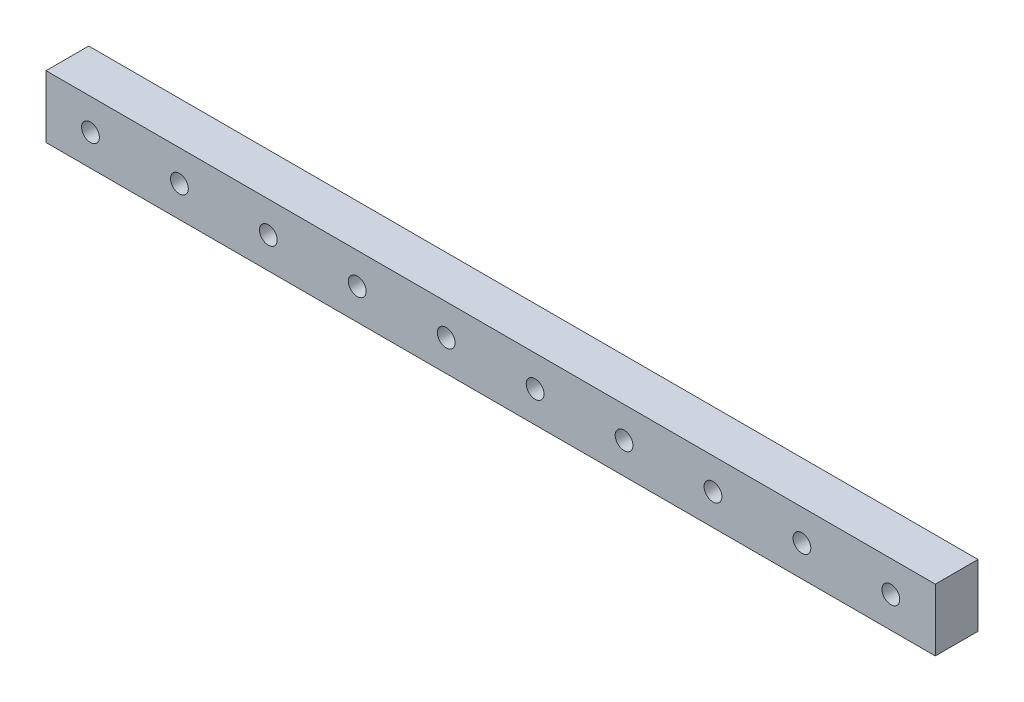
ISO-10303-21;
HEADER;
FILE_DESCRIPTION(('STEP AP214'),'2;1');
FILE_NAME('part.step','',(''),(''),'','','');
FILE_SCHEMA(('AUTOMOTIVE_DESIGN { 1 0 10303 214 1 1 1 1 }'));
ENDSEC;
DATA;
#1=APPLICATION_CONTEXT('core data for automotive mechanical design processes');
#2=APPLICATION_PROTOCOL_DEFINITION('international standard','automotive_design',2000,#1);
#3=PRODUCT_CONTEXT('',#1,'mechanical');
#4=PRODUCT('Part','Part','',(#3));
#5=PRODUCT_RELATED_PRODUCT_CATEGORY('part','',(#4));
#6=PRODUCT_DEFINITION_FORMATION('','',#4);
#7=PRODUCT_DEFINITION_CONTEXT('part definition',#1,'design');
#8=PRODUCT_DEFINITION('design','',#6,#7);
#9=PRODUCT_DEFINITION_SHAPE('','',#8);
#10=(LENGTH_UNIT() NAMED_UNIT(*) SI_UNIT(.MILLI.,.METRE.));
#11=(NAMED_UNIT(*) PLANE_ANGLE_UNIT() SI_UNIT($,.RADIAN.));
#12=(NAMED_UNIT(*) SI_UNIT($,.STERADIAN.) SOLID_ANGLE_UNIT());
#13=UNCERTAINTY_MEASURE_WITH_UNIT(LENGTH_MEASURE(1.E-05),#10,'distance_accuracy_value','');
#14=(GEOMETRIC_REPRESENTATION_CONTEXT(3) GLOBAL_UNCERTAINTY_ASSIGNED_CONTEXT((#13)) GLOBAL_UNIT_ASSIGNED_CONTEXT((#10,
#11,#12)) REPRESENTATION_CONTEXT('',''));
#15=CARTESIAN_POINT('',(0.,0.,0.));
#16=DIRECTION('',(0.,0.,1.));
#17=DIRECTION('',(1.,0.,0.));
#18=AXIS2_PLACEMENT_3D('',#15,#16,#17);
#19=CARTESIAN_POINT('',(0.,0.,4.8));
#20=DIRECTION('',(1.,0.,0.));
#21=DIRECTION('',(0.,0.,-1.));
#22=AXIS2_PLACEMENT_3D('',#19,#20,#21);
#23=PLANE('',#22);
#24=DIRECTION('',(0.,-1.,0.));
#25=VECTOR('',#24,1.);
#26=CARTESIAN_POINT('',(0.,0.,0.));
#27=LINE('',#26,#25);
#28=CARTESIAN_POINT('',(0.,7.,0.));
#29=VERTEX_POINT('',#28);
#30=CARTESIAN_POINT('',(0.,0.,0.));
#31=VERTEX_POINT('',#30);
#32=EDGE_CURVE('E102',#29,#31,#27,.T.);
#33=ORIENTED_EDGE('',*,*,#32,.T.);
#34=DIRECTION('',(0.,0.,-1.));
#35=VECTOR('',#34,1.);
#36=CARTESIAN_POINT('',(0.,0.,4.8));
#37=LINE('',#36,#35);
#38=CARTESIAN_POINT('',(0.,0.,4.8));
#39=VERTEX_POINT('',#38);
#40=EDGE_CURVE('E11',#39,#31,#37,.T.);
#41=ORIENTED_EDGE('',*,*,#40,.F.);
#42=DIRECTION('',(0.,-1.,0.));
#43=VECTOR('',#42,1.);
#44=CARTESIAN_POINT('',(0.,0.,4.8));
#45=LINE('',#44,#43);
#46=CARTESIAN_POINT('',(0.,7.,4.8));
#47=VERTEX_POINT('',#46);
#48=EDGE_CURVE('E90',#47,#39,#45,.T.);
#49=ORIENTED_EDGE('',*,*,#48,.F.);
#50=DIRECTION('',(0.,0.,-1.));
#51=VECTOR('',#50,1.);
#52=CARTESIAN_POINT('',(0.,7.,4.8));
#53=LINE('',#52,#51);
#54=EDGE_CURVE('E98',#47,#29,#53,.T.);
#55=ORIENTED_EDGE('',*,*,#54,.T.);
#56=EDGE_LOOP('',(#33,#41,#49,#55));
#57=FACE_BOUND('',#56,.T.);
#58=ADVANCED_FACE('F39',(#57),#23,.F.);
#59=CARTESIAN_POINT('',(0.,0.,4.8));
#60=DIRECTION('',(0.,1.,0.));
#61=DIRECTION('',(0.,0.,1.));
#62=AXIS2_PLACEMENT_3D('',#59,#60,#61);
#63=PLANE('',#62);
#64=DIRECTION('',(1.,0.,0.));
#65=VECTOR('',#64,1.);
#66=CARTESIAN_POINT('',(0.,0.,0.));
#67=LINE('',#66,#65);
#68=CARTESIAN_POINT('',(100.,0.,0.));
#69=VERTEX_POINT('',#68);
#70=EDGE_CURVE('E94',#31,#69,#67,.T.);
#71=ORIENTED_EDGE('',*,*,#70,.T.);
#72=DIRECTION('',(0.,0.,-1.));
#73=VECTOR('',#72,1.);
#74=CARTESIAN_POINT('',(100.,0.,4.8));
#75=LINE('',#74,#73);
#76=CARTESIAN_POINT('',(100.,0.,4.8));
#77=VERTEX_POINT('',#76);
#78=EDGE_CURVE('E47',#77,#69,#75,.T.);
#79=ORIENTED_EDGE('',*,*,#78,.F.);
#80=DIRECTION('',(1.,0.,0.));
#81=VECTOR('',#80,1.);
#82=CARTESIAN_POINT('',(0.,0.,4.8));
#83=LINE('',#82,#81);
#84=EDGE_CURVE('E85',#39,#77,#83,.T.);
#85=ORIENTED_EDGE('',*,*,#84,.F.);
#86=ORIENTED_EDGE('',*,*,#40,.T.);
#87=EDGE_LOOP('',(#71,#79,#85,#86));
#88=FACE_BOUND('',#87,.T.);
#89=ADVANCED_FACE('F93',(#88),#63,.F.);
#90=CARTESIAN_POINT('',(100.,0.,4.8));
#91=DIRECTION('',(-1.,0.,0.));
#92=DIRECTION('',(0.,0.,1.));
#93=AXIS2_PLACEMENT_3D('',#90,#91,#92);
#94=PLANE('',#93);
#95=DIRECTION('',(0.,1.,0.));
#96=VECTOR('',#95,1.);
#97=CARTESIAN_POINT('',(100.,0.,0.));
#98=LINE('',#97,#96);
#99=CARTESIAN_POINT('',(100.,7.,0.));
#100=VERTEX_POINT('',#99);
#101=EDGE_CURVE('E72',#69,#100,#98,.T.);
#102=ORIENTED_EDGE('',*,*,#101,.T.);
#103=DIRECTION('',(0.,0.,-1.));
#104=VECTOR('',#103,1.);
#105=CARTESIAN_POINT('',(100.,7.,4.8));
#106=LINE('',#105,#104);
#107=CARTESIAN_POINT('',(100.,7.,4.8));
#108=VERTEX_POINT('',#107);
#109=EDGE_CURVE('E95',#108,#100,#106,.T.);
#110=ORIENTED_EDGE('',*,*,#109,.F.);
#111=DIRECTION('',(0.,1.,0.));
#112=VECTOR('',#111,1.);
#113=CARTESIAN_POINT('',(100.,0.,4.8));
#114=LINE('',#113,#112);
#115=EDGE_CURVE('E88',#77,#108,#114,.T.);
#116=ORIENTED_EDGE('',*,*,#115,.F.);
#117=ORIENTED_EDGE('',*,*,#78,.T.);
#118=EDGE_LOOP('',(#102,#110,#116,#117));
#119=FACE_BOUND('',#118,.T.);
#120=ADVANCED_FACE('F96',(#119),#94,.F.);
#121=CARTESIAN_POINT('',(0.,7.,4.8));
#122=DIRECTION('',(0.,-1.,0.));
#123=DIRECTION('',(0.,0.,-1.));
#124=AXIS2_PLACEMENT_3D('',#121,#122,#123);
#125=PLANE('',#124);
#126=DIRECTION('',(-1.,0.,0.));
#127=VECTOR('',#126,1.);
#128=CARTESIAN_POINT('',(0.,7.,0.));
#129=LINE('',#128,#127);
#130=EDGE_CURVE('E78',#100,#29,#129,.T.);
#131=ORIENTED_EDGE('',*,*,#130,.T.);
#132=ORIENTED_EDGE('',*,*,#54,.F.);
#133=DIRECTION('',(-1.,0.,0.));
#134=VECTOR('',#133,1.);
#135=CARTESIAN_POINT('',(0.,7.,4.8));
#136=LINE('',#135,#134);
#137=EDGE_CURVE('E55',#108,#47,#136,.T.);
#138=ORIENTED_EDGE('',*,*,#137,.F.);
#139=ORIENTED_EDGE('',*,*,#109,.T.);
#140=EDGE_LOOP('',(#131,#132,#138,#139));
#141=FACE_BOUND('',#140,.T.);
#142=ADVANCED_FACE('F110',(#141),#125,.F.);
#143=CARTESIAN_POINT('',(0.,0.,4.8));
#144=DIRECTION('',(0.,0.,-1.));
#145=DIRECTION('',(-1.,0.,0.));
#146=AXIS2_PLACEMENT_3D('',#143,#144,#145);
#147=PLANE('',#146);
#148=CARTESIAN_POINT('',(5.,3.5,4.8));
#149=DIRECTION('',(0.,0.,1.));
#150=DIRECTION('',(1.,0.,0.));
#151=AXIS2_PLACEMENT_3D('',#148,#149,#150);
#152=CIRCLE('',#151,1.);
#153=CARTESIAN_POINT('',(6.,3.5,4.8));
#154=VERTEX_POINT('',#153);
#155=EDGE_CURVE('E165',#154,#154,#152,.T.);
#156=ORIENTED_EDGE('',*,*,#155,.F.);
#157=EDGE_LOOP('',(#156));
#158=FACE_BOUND('',#157,.T.);
#159=CARTESIAN_POINT('',(65.,3.5,4.8));
#160=DIRECTION('',(0.,0.,1.));
#161=DIRECTION('',(1.,0.,0.));
#162=AXIS2_PLACEMENT_3D('',#159,#160,#161);
#163=CIRCLE('',#162,0.999999999999998);
#164=CARTESIAN_POINT('',(66.,3.5,4.8));
#165=VERTEX_POINT('',#164);
#166=EDGE_CURVE('E120',#165,#165,#163,.T.);
#167=ORIENTED_EDGE('',*,*,#166,.F.);
#168=EDGE_LOOP('',(#167));
#169=FACE_BOUND('',#168,.T.);
#170=CARTESIAN_POINT('',(95.,3.5,4.8));
#171=DIRECTION('',(0.,0.,1.));
#172=DIRECTION('',(1.,0.,0.));
#173=AXIS2_PLACEMENT_3D('',#170,#171,#172);
#174=CIRCLE('',#173,0.999999999999998);
#175=CARTESIAN_POINT('',(96.,3.5,4.8));
#176=VERTEX_POINT('',#175);
#177=EDGE_CURVE('E119',#176,#176,#174,.T.);
#178=ORIENTED_EDGE('',*,*,#177,.F.);
#179=EDGE_LOOP('',(#178));
#180=FACE_BOUND('',#179,.T.);
#181=CARTESIAN_POINT('',(85.,3.5,4.8));
#182=DIRECTION('',(0.,0.,1.));
#183=DIRECTION('',(1.,0.,0.));
#184=AXIS2_PLACEMENT_3D('',#181,#182,#183);
#185=CIRCLE('',#184,0.999999999999998);
#186=CARTESIAN_POINT('',(86.,3.5,4.8));
#187=VERTEX_POINT('',#186);
#188=EDGE_CURVE('E126',#187,#187,#185,.T.);
#189=ORIENTED_EDGE('',*,*,#188,.F.);
#190=EDGE_LOOP('',(#189));
#191=FACE_BOUND('',#190,.T.);
#192=CARTESIAN_POINT('',(75.,3.5,4.8));
#193=DIRECTION('',(0.,0.,1.));
#194=DIRECTION('',(1.,0.,0.));
#195=AXIS2_PLACEMENT_3D('',#192,#193,#194);
#196=CIRCLE('',#195,0.999999999999998);
#197=CARTESIAN_POINT('',(76.,3.5,4.8));
#198=VERTEX_POINT('',#197);
#199=EDGE_CURVE('E132',#198,#198,#196,.T.);
#200=ORIENTED_EDGE('',*,*,#199,.F.);
#201=EDGE_LOOP('',(#200));
#202=FACE_BOUND('',#201,.T.);
#203=CARTESIAN_POINT('',(55.,3.5,4.8));
#204=DIRECTION('',(0.,0.,1.));
#205=DIRECTION('',(1.,0.,0.));
#206=AXIS2_PLACEMENT_3D('',#203,#204,#205);
#207=CIRCLE('',#206,1.);
#208=CARTESIAN_POINT('',(56.,3.5,4.8));
#209=VERTEX_POINT('',#208);
#210=EDGE_CURVE('E138',#209,#209,#207,.T.);
#211=ORIENTED_EDGE('',*,*,#210,.F.);
#212=EDGE_LOOP('',(#211));
#213=FACE_BOUND('',#212,.T.);
#214=CARTESIAN_POINT('',(45.,3.5,4.8));
#215=DIRECTION('',(0.,0.,1.));
#216=DIRECTION('',(1.,0.,0.));
#217=AXIS2_PLACEMENT_3D('',#214,#215,#216);
#218=CIRCLE('',#217,1.);
#219=CARTESIAN_POINT('',(46.,3.5,4.8));
#220=VERTEX_POINT('',#219);
#221=EDGE_CURVE('E144',#220,#220,#218,.T.);
#222=ORIENTED_EDGE('',*,*,#221,.F.);
#223=EDGE_LOOP('',(#222));
#224=FACE_BOUND('',#223,.T.);
#225=CARTESIAN_POINT('',(35.,3.5,4.8));
#226=DIRECTION('',(0.,0.,1.));
#227=DIRECTION('',(1.,0.,0.));
#228=AXIS2_PLACEMENT_3D('',#225,#226,#227);
#229=CIRCLE('',#228,1.);
#230=CARTESIAN_POINT('',(36.,3.5,4.8));
#231=VERTEX_POINT('',#230);
#232=EDGE_CURVE('E150',#231,#231,#229,.T.);
#233=ORIENTED_EDGE('',*,*,#232,.F.);
#234=EDGE_LOOP('',(#233));
#235=FACE_BOUND('',#234,.T.);
#236=CARTESIAN_POINT('',(25.,3.5,4.8));
#237=DIRECTION('',(0.,0.,1.));
#238=DIRECTION('',(1.,0.,0.));
#239=AXIS2_PLACEMENT_3D('',#236,#237,#238);
#240=CIRCLE('',#239,0.999999999999998);
#241=CARTESIAN_POINT('',(26.,3.5,4.8));
#242=VERTEX_POINT('',#241);
#243=EDGE_CURVE('E156',#242,#242,#240,.T.);
#244=ORIENTED_EDGE('',*,*,#243,.F.);
#245=EDGE_LOOP('',(#244));
#246=FACE_BOUND('',#245,.T.);
#247=CARTESIAN_POINT('',(15.,3.5,4.8));
#248=DIRECTION('',(0.,0.,1.));
#249=DIRECTION('',(1.,0.,0.));
#250=AXIS2_PLACEMENT_3D('',#247,#248,#249);
#251=CIRCLE('',#250,1.);
#252=CARTESIAN_POINT('',(16.,3.5,4.8));
#253=VERTEX_POINT('',#252);
#254=EDGE_CURVE('E162',#253,#253,#251,.T.);
#255=ORIENTED_EDGE('',*,*,#254,.F.);
#256=EDGE_LOOP('',(#255));
#257=FACE_BOUND('',#256,.T.);
#258=ORIENTED_EDGE('',*,*,#48,.T.);
#259=ORIENTED_EDGE('',*,*,#84,.T.);
#260=ORIENTED_EDGE('',*,*,#115,.T.);
#261=ORIENTED_EDGE('',*,*,#137,.T.);
#262=EDGE_LOOP('',(#258,#259,#260,#261));
#263=FACE_BOUND('',#262,.T.);
#264=ADVANCED_FACE('F86',(#158,#169,#180,#191,#202,#213,#224,#235,#246,#257,#263),#147,.F.);
#265=CARTESIAN_POINT('',(0.,0.,0.));
#266=DIRECTION('',(0.,0.,-1.));
#267=DIRECTION('',(-1.,0.,0.));
#268=AXIS2_PLACEMENT_3D('',#265,#266,#267);
#269=PLANE('',#268);
#270=CARTESIAN_POINT('',(5.,3.5,0.));
#271=DIRECTION('',(0.,0.,1.));
#272=DIRECTION('',(1.,0.,0.));
#273=AXIS2_PLACEMENT_3D('',#270,#271,#272);
#274=CIRCLE('',#273,1.);
#275=CARTESIAN_POINT('',(6.,3.5,0.));
#276=VERTEX_POINT('',#275);
#277=EDGE_CURVE('E105',#276,#276,#274,.T.);
#278=ORIENTED_EDGE('',*,*,#277,.T.);
#279=EDGE_LOOP('',(#278));
#280=FACE_BOUND('',#279,.T.);
#281=CARTESIAN_POINT('',(65.,3.5,0.));
#282=DIRECTION('',(0.,0.,1.));
#283=DIRECTION('',(1.,0.,0.));
#284=AXIS2_PLACEMENT_3D('',#281,#282,#283);
#285=CIRCLE('',#284,0.999999999999998);
#286=CARTESIAN_POINT('',(66.,3.5,0.));
#287=VERTEX_POINT('',#286);
#288=EDGE_CURVE('E166',#287,#287,#285,.T.);
#289=ORIENTED_EDGE('',*,*,#288,.T.);
#290=EDGE_LOOP('',(#289));
#291=FACE_BOUND('',#290,.T.);
#292=CARTESIAN_POINT('',(95.,3.5,0.));
#293=DIRECTION('',(0.,0.,1.));
#294=DIRECTION('',(1.,0.,0.));
#295=AXIS2_PLACEMENT_3D('',#292,#293,#294);
#296=CIRCLE('',#295,0.999999999999998);
#297=CARTESIAN_POINT('',(96.,3.5,0.));
#298=VERTEX_POINT('',#297);
#299=EDGE_CURVE('E116',#298,#298,#296,.T.);
#300=ORIENTED_EDGE('',*,*,#299,.T.);
#301=EDGE_LOOP('',(#300));
#302=FACE_BOUND('',#301,.T.);
#303=CARTESIAN_POINT('',(85.,3.5,0.));
#304=DIRECTION('',(0.,0.,1.));
#305=DIRECTION('',(1.,0.,0.));
#306=AXIS2_PLACEMENT_3D('',#303,#304,#305);
#307=CIRCLE('',#306,0.999999999999998);
#308=CARTESIAN_POINT('',(86.,3.5,0.));
#309=VERTEX_POINT('',#308);
#310=EDGE_CURVE('E123',#309,#309,#307,.T.);
#311=ORIENTED_EDGE('',*,*,#310,.T.);
#312=EDGE_LOOP('',(#311));
#313=FACE_BOUND('',#312,.T.);
#314=CARTESIAN_POINT('',(75.,3.5,0.));
#315=DIRECTION('',(0.,0.,1.));
#316=DIRECTION('',(1.,0.,0.));
#317=AXIS2_PLACEMENT_3D('',#314,#315,#316);
#318=CIRCLE('',#317,0.999999999999998);
#319=CARTESIAN_POINT('',(76.,3.5,0.));
#320=VERTEX_POINT('',#319);
#321=EDGE_CURVE('E129',#320,#320,#318,.T.);
#322=ORIENTED_EDGE('',*,*,#321,.T.);
#323=EDGE_LOOP('',(#322));
#324=FACE_BOUND('',#323,.T.);
#325=CARTESIAN_POINT('',(55.,3.5,0.));
#326=DIRECTION('',(0.,0.,1.));
#327=DIRECTION('',(1.,0.,0.));
#328=AXIS2_PLACEMENT_3D('',#325,#326,#327);
#329=CIRCLE('',#328,1.);
#330=CARTESIAN_POINT('',(56.,3.5,0.));
#331=VERTEX_POINT('',#330);
#332=EDGE_CURVE('E135',#331,#331,#329,.T.);
#333=ORIENTED_EDGE('',*,*,#332,.T.);
#334=EDGE_LOOP('',(#333));
#335=FACE_BOUND('',#334,.T.);
#336=CARTESIAN_POINT('',(45.,3.5,0.));
#337=DIRECTION('',(0.,0.,1.));
#338=DIRECTION('',(1.,0.,0.));
#339=AXIS2_PLACEMENT_3D('',#336,#337,#338);
#340=CIRCLE('',#339,1.);
#341=CARTESIAN_POINT('',(46.,3.5,0.));
#342=VERTEX_POINT('',#341);
#343=EDGE_CURVE('E141',#342,#342,#340,.T.);
#344=ORIENTED_EDGE('',*,*,#343,.T.);
#345=EDGE_LOOP('',(#344));
#346=FACE_BOUND('',#345,.T.);
#347=CARTESIAN_POINT('',(35.,3.5,0.));
#348=DIRECTION('',(0.,0.,1.));
#349=DIRECTION('',(1.,0.,0.));
#350=AXIS2_PLACEMENT_3D('',#347,#348,#349);
#351=CIRCLE('',#350,1.);
#352=CARTESIAN_POINT('',(36.,3.5,0.));
#353=VERTEX_POINT('',#352);
#354=EDGE_CURVE('E147',#353,#353,#351,.T.);
#355=ORIENTED_EDGE('',*,*,#354,.T.);
#356=EDGE_LOOP('',(#355));
#357=FACE_BOUND('',#356,.T.);
#358=CARTESIAN_POINT('',(25.,3.5,0.));
#359=DIRECTION('',(0.,0.,1.));
#360=DIRECTION('',(1.,0.,0.));
#361=AXIS2_PLACEMENT_3D('',#358,#359,#360);
#362=CIRCLE('',#361,0.999999999999998);
#363=CARTESIAN_POINT('',(26.,3.5,0.));
#364=VERTEX_POINT('',#363);
#365=EDGE_CURVE('E153',#364,#364,#362,.T.);
#366=ORIENTED_EDGE('',*,*,#365,.T.);
#367=EDGE_LOOP('',(#366));
#368=FACE_BOUND('',#367,.T.);
#369=CARTESIAN_POINT('',(15.,3.5,0.));
#370=DIRECTION('',(0.,0.,1.));
#371=DIRECTION('',(1.,0.,0.));
#372=AXIS2_PLACEMENT_3D('',#369,#370,#371);
#373=CIRCLE('',#372,1.);
#374=CARTESIAN_POINT('',(16.,3.5,0.));
#375=VERTEX_POINT('',#374);
#376=EDGE_CURVE('E159',#375,#375,#373,.T.);
#377=ORIENTED_EDGE('',*,*,#376,.T.);
#378=EDGE_LOOP('',(#377));
#379=FACE_BOUND('',#378,.T.);
#380=ORIENTED_EDGE('',*,*,#32,.F.);
#381=ORIENTED_EDGE('',*,*,#130,.F.);
#382=ORIENTED_EDGE('',*,*,#101,.F.);
#383=ORIENTED_EDGE('',*,*,#70,.F.);
#384=EDGE_LOOP('',(#380,#381,#382,#383));
#385=FACE_BOUND('',#384,.T.);
#386=ADVANCED_FACE('F113',(#280,#291,#302,#313,#324,#335,#346,#357,#368,#379,#385),#269,.T.);
#387=CARTESIAN_POINT('',(15.,3.5,0.));
#388=DIRECTION('',(0.,0.,1.));
#389=DIRECTION('',(1.,0.,0.));
#390=AXIS2_PLACEMENT_3D('',#387,#388,#389);
#391=CYLINDRICAL_SURFACE('',#390,1.);
#392=ORIENTED_EDGE('',*,*,#376,.F.);
#393=EDGE_LOOP('',(#392));
#394=FACE_BOUND('',#393,.T.);
#395=ORIENTED_EDGE('',*,*,#254,.T.);
#396=EDGE_LOOP('',(#395));
#397=FACE_BOUND('',#396,.T.);
#398=ADVANCED_FACE('F206',(#394,#397),#391,.F.);
#399=CARTESIAN_POINT('',(25.,3.5,0.));
#400=DIRECTION('',(0.,0.,1.));
#401=DIRECTION('',(1.,0.,0.));
#402=AXIS2_PLACEMENT_3D('',#399,#400,#401);
#403=CYLINDRICAL_SURFACE('',#402,0.999999999999998);
#404=ORIENTED_EDGE('',*,*,#365,.F.);
#405=EDGE_LOOP('',(#404));
#406=FACE_BOUND('',#405,.T.);
#407=ORIENTED_EDGE('',*,*,#243,.T.);
#408=EDGE_LOOP('',(#407));
#409=FACE_BOUND('',#408,.T.);
#410=ADVANCED_FACE('F208',(#406,#409),#403,.F.);
#411=CARTESIAN_POINT('',(35.,3.5,0.));
#412=DIRECTION('',(0.,0.,1.));
#413=DIRECTION('',(1.,0.,0.));
#414=AXIS2_PLACEMENT_3D('',#411,#412,#413);
#415=CYLINDRICAL_SURFACE('',#414,1.);
#416=ORIENTED_EDGE('',*,*,#354,.F.);
#417=EDGE_LOOP('',(#416));
#418=FACE_BOUND('',#417,.T.);
#419=ORIENTED_EDGE('',*,*,#232,.T.);
#420=EDGE_LOOP('',(#419));
#421=FACE_BOUND('',#420,.T.);
#422=ADVANCED_FACE('F215',(#418,#421),#415,.F.);
#423=CARTESIAN_POINT('',(45.,3.5,0.));
#424=DIRECTION('',(0.,0.,1.));
#425=DIRECTION('',(1.,0.,0.));
#426=AXIS2_PLACEMENT_3D('',#423,#424,#425);
#427=CYLINDRICAL_SURFACE('',#426,1.);
#428=ORIENTED_EDGE('',*,*,#343,.F.);
#429=EDGE_LOOP('',(#428));
#430=FACE_BOUND('',#429,.T.);
#431=ORIENTED_EDGE('',*,*,#221,.T.);
#432=EDGE_LOOP('',(#431));
#433=FACE_BOUND('',#432,.T.);
#434=ADVANCED_FACE('F247',(#430,#433),#427,.F.);
#435=CARTESIAN_POINT('',(55.,3.5,0.));
#436=DIRECTION('',(0.,0.,1.));
#437=DIRECTION('',(1.,0.,0.));
#438=AXIS2_PLACEMENT_3D('',#435,#436,#437);
#439=CYLINDRICAL_SURFACE('',#438,1.);
#440=ORIENTED_EDGE('',*,*,#332,.F.);
#441=EDGE_LOOP('',(#440));
#442=FACE_BOUND('',#441,.T.);
#443=ORIENTED_EDGE('',*,*,#210,.T.);
#444=EDGE_LOOP('',(#443));
#445=FACE_BOUND('',#444,.T.);
#446=ADVANCED_FACE('F243',(#442,#445),#439,.F.);
#447=CARTESIAN_POINT('',(75.,3.5,0.));
#448=DIRECTION('',(0.,0.,1.));
#449=DIRECTION('',(1.,0.,0.));
#450=AXIS2_PLACEMENT_3D('',#447,#448,#449);
#451=CYLINDRICAL_SURFACE('',#450,0.999999999999998);
#452=ORIENTED_EDGE('',*,*,#321,.F.);
#453=EDGE_LOOP('',(#452));
#454=FACE_BOUND('',#453,.T.);
#455=ORIENTED_EDGE('',*,*,#199,.T.);
#456=EDGE_LOOP('',(#455));
#457=FACE_BOUND('',#456,.T.);
#458=ADVANCED_FACE('F239',(#454,#457),#451,.F.);
#459=CARTESIAN_POINT('',(85.,3.5,0.));
#460=DIRECTION('',(0.,0.,1.));
#461=DIRECTION('',(1.,0.,0.));
#462=AXIS2_PLACEMENT_3D('',#459,#460,#461);
#463=CYLINDRICAL_SURFACE('',#462,0.999999999999998);
#464=ORIENTED_EDGE('',*,*,#310,.F.);
#465=EDGE_LOOP('',(#464));
#466=FACE_BOUND('',#465,.T.);
#467=ORIENTED_EDGE('',*,*,#188,.T.);
#468=EDGE_LOOP('',(#467));
#469=FACE_BOUND('',#468,.T.);
#470=ADVANCED_FACE('F235',(#466,#469),#463,.F.);
#471=CARTESIAN_POINT('',(95.,3.5,0.));
#472=DIRECTION('',(0.,0.,1.));
#473=DIRECTION('',(1.,0.,0.));
#474=AXIS2_PLACEMENT_3D('',#471,#472,#473);
#475=CYLINDRICAL_SURFACE('',#474,0.999999999999998);
#476=ORIENTED_EDGE('',*,*,#299,.F.);
#477=EDGE_LOOP('',(#476));
#478=FACE_BOUND('',#477,.T.);
#479=ORIENTED_EDGE('',*,*,#177,.T.);
#480=EDGE_LOOP('',(#479));
#481=FACE_BOUND('',#480,.T.);
#482=ADVANCED_FACE('F232',(#478,#481),#475,.F.);
#483=CARTESIAN_POINT('',(65.,3.5,0.));
#484=DIRECTION('',(0.,0.,1.));
#485=DIRECTION('',(1.,0.,0.));
#486=AXIS2_PLACEMENT_3D('',#483,#484,#485);
#487=CYLINDRICAL_SURFACE('',#486,0.999999999999998);
#488=ORIENTED_EDGE('',*,*,#288,.F.);
#489=EDGE_LOOP('',(#488));
#490=FACE_BOUND('',#489,.T.);
#491=ORIENTED_EDGE('',*,*,#166,.T.);
#492=EDGE_LOOP('',(#491));
#493=FACE_BOUND('',#492,.T.);
#494=ADVANCED_FACE('F181',(#490,#493),#487,.F.);
#495=CARTESIAN_POINT('',(5.,3.5,0.));
#496=DIRECTION('',(0.,0.,1.));
#497=DIRECTION('',(1.,0.,0.));
#498=AXIS2_PLACEMENT_3D('',#495,#496,#497);
#499=CYLINDRICAL_SURFACE('',#498,1.);
#500=ORIENTED_EDGE('',*,*,#277,.F.);
#501=EDGE_LOOP('',(#500));
#502=FACE_BOUND('',#501,.T.);
#503=ORIENTED_EDGE('',*,*,#155,.T.);
#504=EDGE_LOOP('',(#503));
#505=FACE_BOUND('',#504,.T.);
#506=ADVANCED_FACE('F178',(#502,#505),#499,.F.);
#507=CLOSED_SHELL('',(#58,#89,#120,#142,#264,#386,#398,#410,#422,#434,#446,#458,#470,#482,#494,#506));
#508=MANIFOLD_SOLID_BREP('B2',#507);
#509=ADVANCED_BREP_SHAPE_REPRESENTATION('',(#18,#508),#14);
#510=SHAPE_DEFINITION_REPRESENTATION(#9,#509);
ENDSEC;
END-ISO-10303-21;
